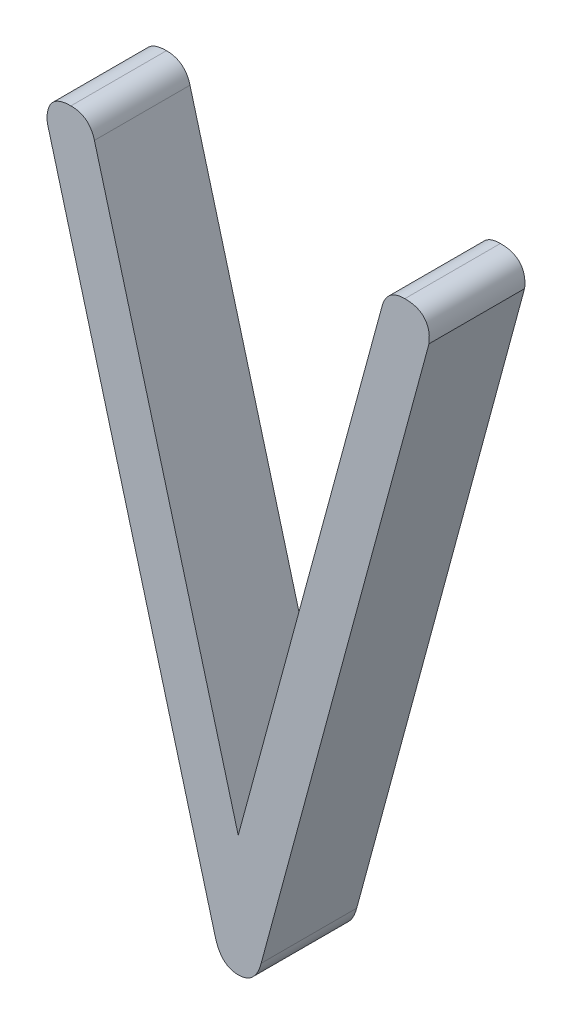
ISO-10303-21;
HEADER;
FILE_DESCRIPTION(('STEP AP214'),'2;1');
FILE_NAME('part.step','',(''),(''),'','','');
FILE_SCHEMA(('AUTOMOTIVE_DESIGN { 1 0 10303 214 1 1 1 1 }'));
ENDSEC;
DATA;
#1=APPLICATION_CONTEXT('core data for automotive mechanical design processes');
#2=APPLICATION_PROTOCOL_DEFINITION('international standard','automotive_design',2000,#1);
#3=PRODUCT_CONTEXT('',#1,'mechanical');
#4=PRODUCT('Part','Part','',(#3));
#5=PRODUCT_RELATED_PRODUCT_CATEGORY('part','',(#4));
#6=PRODUCT_DEFINITION_FORMATION('','',#4);
#7=PRODUCT_DEFINITION_CONTEXT('part definition',#1,'design');
#8=PRODUCT_DEFINITION('design','',#6,#7);
#9=PRODUCT_DEFINITION_SHAPE('','',#8);
#10=(LENGTH_UNIT() NAMED_UNIT(*) SI_UNIT(.MILLI.,.METRE.));
#11=(NAMED_UNIT(*) PLANE_ANGLE_UNIT() SI_UNIT($,.RADIAN.));
#12=(NAMED_UNIT(*) SI_UNIT($,.STERADIAN.) SOLID_ANGLE_UNIT());
#13=UNCERTAINTY_MEASURE_WITH_UNIT(LENGTH_MEASURE(1.E-05),#10,'distance_accuracy_value','');
#14=(GEOMETRIC_REPRESENTATION_CONTEXT(3) GLOBAL_UNCERTAINTY_ASSIGNED_CONTEXT((#13)) GLOBAL_UNIT_ASSIGNED_CONTEXT((#10,
#11,#12)) REPRESENTATION_CONTEXT('',''));
#15=CARTESIAN_POINT('',(0.,0.,0.));
#16=DIRECTION('',(0.,0.,1.));
#17=DIRECTION('',(1.,0.,0.));
#18=AXIS2_PLACEMENT_3D('',#15,#16,#17);
#19=CARTESIAN_POINT('',(0.,0.,-0.1));
#20=DIRECTION('',(0.,0.,1.));
#21=DIRECTION('',(1.,0.,0.));
#22=AXIS2_PLACEMENT_3D('',#19,#20,#21);
#23=PLANE('',#22);
#24=DIRECTION('',(0.261841637735637,-0.96511085205168,0.));
#25=VECTOR('',#24,1.);
#26=CARTESIAN_POINT('',(20.5513802553988,5.1464524175906,-0.1));
#27=LINE('',#26,#25);
#28=CARTESIAN_POINT('',(20.5508815053987,5.1502761675906,-0.1));
#29=VERTEX_POINT('',#28);
#30=CARTESIAN_POINT('',(20.7264677553988,4.5011049175906,-0.1));
#31=VERTEX_POINT('',#30);
#32=EDGE_CURVE('E125',#29,#31,#27,.T.);
#33=ORIENTED_EDGE('',*,*,#32,.F.);
#34=CARTESIAN_POINT('',(20.5503827553987,5.1502761675906,-0.1));
#35=CARTESIAN_POINT('',(20.5503926914682,5.15131923329889,-0.1));
#36=CARTESIAN_POINT('',(20.5503822868826,5.15236313262038,-0.1));
#37=CARTESIAN_POINT('',(20.5503832259426,5.15445522281212,-0.1));
#38=CARTESIAN_POINT('',(20.5503946639154,5.15550341270101,-0.1));
#39=CARTESIAN_POINT('',(20.5505591669211,5.1586917506111,-0.1));
#40=CARTESIAN_POINT('',(20.550847726788,5.1608284842916,-0.1));
#41=CARTESIAN_POINT('',(20.5519335163355,5.16506486304129,-0.1));
#42=CARTESIAN_POINT('',(20.5527472786877,5.16716093512788,-0.1));
#43=CARTESIAN_POINT('',(20.5550934541722,5.1709583618669,-0.1));
#44=CARTESIAN_POINT('',(20.5566312812085,5.17265659610451,-0.1));
#45=CARTESIAN_POINT('',(20.5600219457876,5.17520395245335,-0.1));
#46=CARTESIAN_POINT('',(20.5618239221849,5.1761241445683,-0.1));
#47=CARTESIAN_POINT('',(20.5668126279588,5.17794027385817,-0.1));
#48=CARTESIAN_POINT('',(20.5701348321766,5.17842750106713,-0.1));
#49=CARTESIAN_POINT('',(20.5740958257601,5.17858686534779,-0.1));
#50=CARTESIAN_POINT('',(20.5747530930678,5.17859927637395,-0.1));
#51=CARTESIAN_POINT('',(20.5754077553988,5.1785999175906,-0.1));
#52=B_SPLINE_CURVE_WITH_KNOTS('',3,(#34,#35,#36,#37,#38,#39,#40,#41,#42,#43,#44,#45,#46,#47,#48,
#49,#50,#51),.UNSPECIFIED.,.F.,.F.,(4,2,2,2,2,2,2,2,4),(0.,0.00313075123016277,
0.00627505320438631,0.0127047529926475,0.0193474314733686,0.0260405864184235,0.032022274007408,
0.0419124095932146,0.0438827667619286),.UNSPECIFIED.);
#53=CARTESIAN_POINT('',(20.5754077553988,5.1785999175906,-0.1));
#54=VERTEX_POINT('',#53);
#55=EDGE_CURVE('E273',#29,#54,#52,.T.);
#56=ORIENTED_EDGE('',*,*,#55,.T.);
#57=CARTESIAN_POINT('',(20.5754077553988,5.1785999175906,-0.1));
#58=CARTESIAN_POINT('',(20.5771220932541,5.1785979741548,-0.1));
#59=CARTESIAN_POINT('',(20.5788500136896,5.17848730559865,-0.1));
#60=CARTESIAN_POINT('',(20.5822779690591,5.17796685450748,-0.1));
#61=CARTESIAN_POINT('',(20.5839774528449,5.17755363826389,-0.1));
#62=CARTESIAN_POINT('',(20.5878340448713,5.17612688013809,-0.1));
#63=CARTESIAN_POINT('',(20.5899382341426,5.17495181002841,-0.1));
#64=CARTESIAN_POINT('',(20.593598454675,5.17194147811202,-0.1));
#65=CARTESIAN_POINT('',(20.5951543307068,5.17010602964674,-0.1));
#66=CARTESIAN_POINT('',(20.5972446719747,5.1667848040212,-0.1));
#67=CARTESIAN_POINT('',(20.5979464602816,5.16539449490216,-0.1));
#68=CARTESIAN_POINT('',(20.5991334522155,5.16254471216893,-0.1));
#69=CARTESIAN_POINT('',(20.599621447486,5.16108642331219,-0.1));
#70=CARTESIAN_POINT('',(20.6000302553988,5.1596124175906,-0.1));
#71=B_SPLINE_CURVE_WITH_KNOTS('',3,(#57,#58,#59,#60,#61,#62,#63,#64,#65,#66,#67,#68,#69,#70),
.UNSPECIFIED.,.F.,.F.,(4,2,2,2,2,2,4),(0.,0.00515979265660272,0.0103790714029258,
0.0174595134135614,0.0245419583133709,0.0291992832963221,0.0337938368651175),.UNSPECIFIED.);
#72=CARTESIAN_POINT('',(20.6000302553988,5.1596124175906,-0.1));
#73=VERTEX_POINT('',#72);
#74=EDGE_CURVE('E132',#54,#73,#71,.T.);
#75=ORIENTED_EDGE('',*,*,#74,.T.);
#76=DIRECTION('',(-0.261857023404159,0.965106677675537,0.));
#77=VECTOR('',#76,1.);
#78=CARTESIAN_POINT('',(20.7504952553988,4.6050549175906,-0.1));
#79=LINE('',#78,#77);
#80=CARTESIAN_POINT('',(20.7504952553988,4.60505491759061,-0.1));
#81=VERTEX_POINT('',#80);
#82=EDGE_CURVE('E129',#81,#73,#79,.T.);
#83=ORIENTED_EDGE('',*,*,#82,.F.);
#84=DIRECTION('',(-0.261820959999833,-0.965116461834926,0.));
#85=VECTOR('',#84,1.);
#86=CARTESIAN_POINT('',(20.9009427553987,5.1596299175906,-0.1));
#87=LINE('',#86,#85);
#88=CARTESIAN_POINT('',(20.9009427553987,5.1596299175906,-0.1));
#89=VERTEX_POINT('',#88);
#90=EDGE_CURVE('E136',#89,#81,#87,.T.);
#91=ORIENTED_EDGE('',*,*,#90,.F.);
#92=CARTESIAN_POINT('',(20.9009427553987,5.1596299175906,-0.1));
#93=CARTESIAN_POINT('',(20.9013777429837,5.16123757433473,-0.1));
#94=CARTESIAN_POINT('',(20.9019049288769,5.16283119943136,-0.1));
#95=CARTESIAN_POINT('',(20.9032121772409,5.16593741324232,-0.1));
#96=CARTESIAN_POINT('',(20.9039959831498,5.16744839023491,-0.1));
#97=CARTESIAN_POINT('',(20.906231879075,5.17082008145454,-0.1));
#98=CARTESIAN_POINT('',(20.9078246946511,5.17259595674711,-0.1));
#99=CARTESIAN_POINT('',(20.9115483796059,5.17546501299798,-0.1));
#100=CARTESIAN_POINT('',(20.9136805900192,5.17655646848187,-0.1));
#101=CARTESIAN_POINT('',(20.9173603988267,5.17776821155771,-0.1));
#102=CARTESIAN_POINT('',(20.918849400089,5.17809515677756,-0.1));
#103=CARTESIAN_POINT('',(20.9218442270327,5.17850849568542,-0.1));
#104=CARTESIAN_POINT('',(20.9233496473208,5.17859768028002,-0.1));
#105=CARTESIAN_POINT('',(20.9248477553988,5.1785999175906,-0.1));
#106=B_SPLINE_CURVE_WITH_KNOTS('',3,(#92,#93,#94,#95,#96,#97,#98,#99,#100,#101,#102,#103,#104,
#105),.UNSPECIFIED.,.F.,.F.,(4,2,2,2,2,2,4),(0.,0.00500870235049051,0.0100939920533278,
0.0171088488728929,0.0241413203207593,0.028696895640469,0.0331987558213404),.UNSPECIFIED.);
#107=CARTESIAN_POINT('',(20.9248477553988,5.1785999175906,-0.1));
#108=VERTEX_POINT('',#107);
#109=EDGE_CURVE('E242',#89,#108,#106,.T.);
#110=ORIENTED_EDGE('',*,*,#109,.T.);
#111=CARTESIAN_POINT('',(20.9248477553988,5.1785999175906,-0.1));
#112=CARTESIAN_POINT('',(20.9285446784325,5.17860849001704,-0.1));
#113=CARTESIAN_POINT('',(20.932547482492,5.17821770700011,-0.1));
#114=CARTESIAN_POINT('',(20.9383785751184,5.17634146861894,-0.1));
#115=CARTESIAN_POINT('',(20.9404147789504,5.17538385358481,-0.1));
#116=CARTESIAN_POINT('',(20.9440457906898,5.17276736871181,-0.1));
#117=CARTESIAN_POINT('',(20.9456374338623,5.17110367334118,-0.1));
#118=CARTESIAN_POINT('',(20.9479678477753,5.16752341263488,-0.1));
#119=CARTESIAN_POINT('',(20.9487766177684,5.16564946446871,-0.1));
#120=CARTESIAN_POINT('',(20.9498553104023,5.16204020458042,-0.1));
#121=CARTESIAN_POINT('',(20.9501832660136,5.16032036223004,-0.1));
#122=CARTESIAN_POINT('',(20.9505561402529,5.15684711309351,-0.1));
#123=CARTESIAN_POINT('',(20.9505995325504,5.15509357582134,-0.1));
#124=CARTESIAN_POINT('',(20.9506125523949,5.15231810631168,-0.1));
#125=CARTESIAN_POINT('',(20.9506053803397,5.15129574251738,-0.1));
#126=CARTESIAN_POINT('',(20.9506077553988,5.15027616759061,-0.1));
#127=B_SPLINE_CURVE_WITH_KNOTS('',3,(#111,#112,#113,#114,#115,#116,#117,#118,#119,#120,#121,
#122,#123,#124,#125,#126),.UNSPECIFIED.,.F.,.F.,(4,2,2,2,2,2,2,4),(0.,0.0114964904955316,
0.0181713735883877,0.0248926283547071,0.0309338278853881,0.0361589297978823,0.0414120351607045,
0.0444765603155986),.UNSPECIFIED.);
#128=CARTESIAN_POINT('',(20.9501002553988,5.15027616759061,-0.1));
#129=VERTEX_POINT('',#128);
#130=EDGE_CURVE('E142',#108,#129,#127,.T.);
#131=ORIENTED_EDGE('',*,*,#130,.T.);
#132=DIRECTION('',(0.261841637735637,0.96511085205168,0.));
#133=VECTOR('',#132,1.);
#134=CARTESIAN_POINT('',(20.7745052553987,4.5011049175906,-0.1));
#135=LINE('',#134,#133);
#136=CARTESIAN_POINT('',(20.7745052553987,4.5011049175906,-0.1));
#137=VERTEX_POINT('',#136);
#138=EDGE_CURVE('E105',#137,#129,#135,.T.);
#139=ORIENTED_EDGE('',*,*,#138,.F.);
#140=CARTESIAN_POINT('',(20.7745052553987,4.5011049175906,-0.1));
#141=CARTESIAN_POINT('',(20.7734513501889,4.497031947576,-0.1));
#142=CARTESIAN_POINT('',(20.7718391726223,4.49274022927304,-0.1));
#143=CARTESIAN_POINT('',(20.7680751256805,4.48690019066076,-0.1));
#144=CARTESIAN_POINT('',(20.7664474830121,4.48496286314128,-0.1));
#145=CARTESIAN_POINT('',(20.763549435342,4.4825598583929,-0.1));
#146=CARTESIAN_POINT('',(20.7625012533111,4.48184049428395,-0.1));
#147=CARTESIAN_POINT('',(20.7602822340124,4.48061403594939,-0.1));
#148=CARTESIAN_POINT('',(20.7591108780044,4.48010788838571,-0.1));
#149=CARTESIAN_POINT('',(20.7567066422162,4.47932353026134,-0.1));
#150=CARTESIAN_POINT('',(20.7554743331198,4.4790435189457,-0.1));
#151=CARTESIAN_POINT('',(20.7529853618357,4.47868100202924,-0.1));
#152=CARTESIAN_POINT('',(20.7517288194802,4.47859769550437,-0.1));
#153=CARTESIAN_POINT('',(20.7504777553988,4.4785999175906,-0.1));
#154=B_SPLINE_CURVE_WITH_KNOTS('',3,(#140,#141,#142,#143,#144,#145,#146,#147,#148,#149,#150,
#151,#152,#153),.UNSPECIFIED.,.F.,.F.,(4,2,2,2,2,2,4),(0.,0.0130938825250307,0.0205978279718477,
0.024385869987406,0.0281905576840755,0.0319646408114679,0.0357233302826738),.UNSPECIFIED.);
#155=CARTESIAN_POINT('',(20.7504777553988,4.4785999175906,-0.1));
#156=VERTEX_POINT('',#155);
#157=EDGE_CURVE('E100',#137,#156,#154,.T.);
#158=ORIENTED_EDGE('',*,*,#157,.T.);
#159=CARTESIAN_POINT('',(20.7504777553988,4.4785999175906,-0.1));
#160=CARTESIAN_POINT('',(20.7492059868726,4.47860100638479,-0.1));
#161=CARTESIAN_POINT('',(20.7479299963499,4.47868547864956,-0.1));
#162=CARTESIAN_POINT('',(20.745405068384,4.47905714635881,-0.1));
#163=CARTESIAN_POINT('',(20.7441562242563,4.47934495312802,-0.1));
#164=CARTESIAN_POINT('',(20.7405102196661,4.48056888496283,-0.1));
#165=CARTESIAN_POINT('',(20.7382197635953,4.48186584697579,-0.1));
#166=CARTESIAN_POINT('',(20.7345314163769,4.48498347947588,-0.1));
#167=CARTESIAN_POINT('',(20.7330591785432,4.48672208645621,-0.1));
#168=CARTESIAN_POINT('',(20.7295492226181,4.49197653053387,-0.0999999999999999));
#169=CARTESIAN_POINT('',(20.7280005509623,4.49580189288801,-0.0999999999999999));
#170=CARTESIAN_POINT('',(20.7267248181419,4.50016427259193,-0.1));
#171=CARTESIAN_POINT('',(20.7265935687219,4.50063443497494,-0.1));
#172=CARTESIAN_POINT('',(20.7264677553988,4.5011049175906,-0.1));
#173=B_SPLINE_CURVE_WITH_KNOTS('',3,(#159,#160,#161,#162,#163,#164,#165,#166,#167,#168,#169,
#170,#171,#172),.UNSPECIFIED.,.F.,.F.,(4,2,2,2,2,2,4),(0.,0.00381795813841378,
0.00764744407759295,0.0153238713628667,0.0220741473082082,0.0342216202552871,0.03568553496631),.UNSPECIFIED.);
#174=EDGE_CURVE('E24',#156,#31,#173,.T.);
#175=ORIENTED_EDGE('',*,*,#174,.T.);
#176=EDGE_LOOP('',(#33,#56,#75,#83,#91,#110,#131,#139,#158,#175));
#177=FACE_BOUND('',#176,.T.);
#178=ADVANCED_FACE('F17',(#177),#23,.F.);
#179=CARTESIAN_POINT('',(20.7264677553988,4.5011049175906,-0.1));
#180=CARTESIAN_POINT('',(20.7324702553988,4.4785999175906,-0.1));
#181=CARTESIAN_POINT('',(20.7504777553988,4.4785999175906,-0.1));
#182=CARTESIAN_POINT('',(20.7264677553988,4.5011049175906,0.));
#183=CARTESIAN_POINT('',(20.7324702553988,4.4785999175906,0.));
#184=CARTESIAN_POINT('',(20.7504777553988,4.4785999175906,0.));
#185=B_SPLINE_SURFACE_WITH_KNOTS('',1,2,((#179,#180,#181),(#182,#183,#184)),.UNSPECIFIED.,.F.,
.F.,.F.,(2,2),(3,3),(0.,1.),(0.,1.),.UNSPECIFIED.);
#186=DIRECTION('',(0.,0.,1.));
#187=VECTOR('',#186,1.);
#188=CARTESIAN_POINT('',(20.7264677553988,4.5011049175906,-0.1));
#189=LINE('',#188,#187);
#190=CARTESIAN_POINT('',(20.7264677553988,4.5011049175906,0.));
#191=VERTEX_POINT('',#190);
#192=EDGE_CURVE('E114',#31,#191,#189,.T.);
#193=DIRECTION('',(0.,0.,1.));
#194=VECTOR('',#193,1.);
#195=CARTESIAN_POINT('',(20.7504777553988,4.4785999175906,-0.05));
#196=LINE('',#195,#194);
#197=CARTESIAN_POINT('',(20.7504777553988,4.4785999175906,0.));
#198=VERTEX_POINT('',#197);
#199=EDGE_CURVE('E109',#156,#198,#196,.T.);
#200=CARTESIAN_POINT('',(20.7264677553988,4.5011049175906,0.));
#201=CARTESIAN_POINT('',(20.7275221276277,4.49703236671276,0.));
#202=CARTESIAN_POINT('',(20.729133381543,4.49274032524462,0.));
#203=CARTESIAN_POINT('',(20.7328952989371,4.48690019714537,0.));
#204=CARTESIAN_POINT('',(20.7345215813636,4.48496313772351,0.));
#205=CARTESIAN_POINT('',(20.7374175659814,4.48255999201173,0.));
#206=CARTESIAN_POINT('',(20.7384650785732,4.48184047937136,0.));
#207=CARTESIAN_POINT('',(20.7406828468784,4.48061374137611,0.));
#208=CARTESIAN_POINT('',(20.7418536197067,4.48010745886521,0.));
#209=CARTESIAN_POINT('',(20.7442558793498,4.4793232581734,0.));
#210=CARTESIAN_POINT('',(20.7454867419015,4.47904337144059,0.));
#211=CARTESIAN_POINT('',(20.7479728890433,4.47868098166434,0.));
#212=CARTESIAN_POINT('',(20.7492280551648,4.47859768738367,0.));
#213=CARTESIAN_POINT('',(20.7504777553988,4.4785999175906,0.));
#214=B_SPLINE_CURVE_WITH_KNOTS('',3,(#200,#201,#202,#203,#204,#205,#206,#207,#208,#209,#210,
#211,#212,#213),.UNSPECIFIED.,.F.,.F.,(4,2,2,2,2,2,4),(0.,0.0130937867306439,0.02059464785892,
0.0243812846568324,0.0281844934508406,0.0319542660278823,0.0357088401120995),.UNSPECIFIED.);
#215=EDGE_CURVE('E263',#191,#198,#214,.T.);
#216=ORIENTED_EDGE('',*,*,#192,.F.);
#217=ORIENTED_EDGE('',*,*,#174,.F.);
#218=ORIENTED_EDGE('',*,*,#199,.T.);
#219=ORIENTED_EDGE('',*,*,#215,.F.);
#220=EDGE_LOOP('',(#216,#217,#218,#219));
#221=FACE_BOUND('',#220,.T.);
#222=ADVANCED_FACE('F111',(#221),#185,.F.);
#223=CARTESIAN_POINT('',(20.7504777553988,4.4785999175906,-0.1));
#224=CARTESIAN_POINT('',(20.7685027553988,4.4785999175906,-0.1));
#225=CARTESIAN_POINT('',(20.7745052553987,4.5011049175906,-0.1));
#226=CARTESIAN_POINT('',(20.7504777553988,4.4785999175906,0.));
#227=CARTESIAN_POINT('',(20.7685027553988,4.4785999175906,0.));
#228=CARTESIAN_POINT('',(20.7745052553987,4.5011049175906,0.));
#229=B_SPLINE_SURFACE_WITH_KNOTS('',1,2,((#223,#224,#225),(#226,#227,#228)),.UNSPECIFIED.,.F.,
.F.,.F.,(2,2),(3,3),(0.,1.),(0.,1.),.UNSPECIFIED.);
#230=DIRECTION('',(0.,0.,1.));
#231=VECTOR('',#230,1.);
#232=CARTESIAN_POINT('',(20.7745052553987,4.5011049175906,-0.1));
#233=LINE('',#232,#231);
#234=CARTESIAN_POINT('',(20.7745052553987,4.5011049175906,0.));
#235=VERTEX_POINT('',#234);
#236=EDGE_CURVE('E120',#235,#137,#233,.F.);
#237=CARTESIAN_POINT('',(20.7504777553988,4.4785999175906,0.));
#238=CARTESIAN_POINT('',(20.7517514337389,4.47860102381493,0.));
#239=CARTESIAN_POINT('',(20.7530293469448,4.47868557449693,0.));
#240=CARTESIAN_POINT('',(20.7555581355951,4.47905768099655,0.));
#241=CARTESIAN_POINT('',(20.7568089165475,4.47934585600213,0.));
#242=CARTESIAN_POINT('',(20.760460606622,4.48057157418933,0.));
#243=CARTESIAN_POINT('',(20.7627546567312,4.48187063842538,0.));
#244=CARTESIAN_POINT('',(20.7664471332069,4.48499294041424,0.));
#245=CARTESIAN_POINT('',(20.7679203956853,4.48673360329477,0.));
#246=CARTESIAN_POINT('',(20.7714308511796,4.49199227282236,0.));
#247=CARTESIAN_POINT('',(20.772978990632,4.49581963978829,0.));
#248=CARTESIAN_POINT('',(20.7742518331305,4.50017730249887,0.));
#249=CARTESIAN_POINT('',(20.7743811910074,4.50064095174428,0.));
#250=CARTESIAN_POINT('',(20.7745052553987,4.5011049175906,0.));
#251=B_SPLINE_CURVE_WITH_KNOTS('',3,(#237,#238,#239,#240,#241,#242,#243,#244,#245,#246,#247,
#248,#249,#250),.UNSPECIFIED.,.F.,.F.,(4,2,2,2,2,2,4),(0.,0.00382370389000962,
0.00765908535028387,0.0153473873778807,0.0221042106873985,0.034256344667909,0.0356999344152006),.UNSPECIFIED.);
#252=EDGE_CURVE('E118',#198,#235,#251,.T.);
#253=ORIENTED_EDGE('',*,*,#199,.F.);
#254=ORIENTED_EDGE('',*,*,#157,.F.);
#255=ORIENTED_EDGE('',*,*,#236,.F.);
#256=ORIENTED_EDGE('',*,*,#252,.F.);
#257=EDGE_LOOP('',(#253,#254,#255,#256));
#258=FACE_BOUND('',#257,.T.);
#259=ADVANCED_FACE('F116',(#258),#229,.F.);
#260=CARTESIAN_POINT('',(20.7745052553987,4.5011049175906,-0.1));
#261=DIRECTION('',(0.96511085205168,-0.261841637735637,0.));
#262=DIRECTION('',(0.261841637735637,0.96511085205168,0.));
#263=AXIS2_PLACEMENT_3D('',#260,#261,#262);
#264=PLANE('',#263);
#265=ORIENTED_EDGE('',*,*,#138,.T.);
#266=DIRECTION('',(0.,0.,1.));
#267=VECTOR('',#266,1.);
#268=CARTESIAN_POINT('',(20.9506077553988,5.1501935625185,-0.1));
#269=LINE('',#268,#267);
#270=CARTESIAN_POINT('',(20.9501002553988,5.15027616759061,0.));
#271=VERTEX_POINT('',#270);
#272=EDGE_CURVE('E248',#129,#271,#269,.T.);
#273=ORIENTED_EDGE('',*,*,#272,.T.);
#274=DIRECTION('',(0.261841637735772,0.965110852051643,0.));
#275=VECTOR('',#274,1.);
#276=CARTESIAN_POINT('',(20.7745052553987,4.5011049175906,0.));
#277=LINE('',#276,#275);
#278=EDGE_CURVE('E261',#235,#271,#277,.T.);
#279=ORIENTED_EDGE('',*,*,#278,.F.);
#280=ORIENTED_EDGE('',*,*,#236,.T.);
#281=EDGE_LOOP('',(#265,#273,#279,#280));
#282=FACE_BOUND('',#281,.T.);
#283=ADVANCED_FACE('F195',(#282),#264,.T.);
#284=CARTESIAN_POINT('',(20.9506077553988,5.14995922509061,-0.1));
#285=CARTESIAN_POINT('',(20.9506077553988,5.1520295713406,-0.1));
#286=CARTESIAN_POINT('',(20.9506077553988,5.1540999175906,-0.1));
#287=CARTESIAN_POINT('',(20.9506077553988,5.1785999175906,-0.1));
#288=CARTESIAN_POINT('',(20.9248477553988,5.1785999175906,-0.1));
#289=CARTESIAN_POINT('',(20.9506077553988,5.14995922509061,0.));
#290=CARTESIAN_POINT('',(20.9506077553988,5.1520295713406,0.));
#291=CARTESIAN_POINT('',(20.9506077553988,5.1540999175906,0.));
#292=CARTESIAN_POINT('',(20.9506077553988,5.1785999175906,0.));
#293=CARTESIAN_POINT('',(20.9248477553988,5.1785999175906,0.));
#294=B_SPLINE_SURFACE_WITH_KNOTS('',1,2,((#284,#285,#286,#287,#288),(#289,#290,#291,#292,#293)),
.UNSPECIFIED.,.F.,.F.,.F.,(2,2),(3,2,3),(0.,1.),(-0.0845039285713122,0.,1.),.UNSPECIFIED.);
#295=DIRECTION('',(0.,0.,1.));
#296=VECTOR('',#295,1.);
#297=CARTESIAN_POINT('',(20.9248477553988,5.1785999175906,-0.05));
#298=LINE('',#297,#296);
#299=CARTESIAN_POINT('',(20.9248477553988,5.1785999175906,0.));
#300=VERTEX_POINT('',#299);
#301=EDGE_CURVE('E247',#108,#300,#298,.T.);
#302=CARTESIAN_POINT('',(20.9506077553988,5.15027616759061,0.));
#303=CARTESIAN_POINT('',(20.9505966781294,5.15128182177798,0.));
#304=CARTESIAN_POINT('',(20.9506068071444,5.15228827879153,0.));
#305=CARTESIAN_POINT('',(20.950608707316,5.1543049130354,0.));
#306=CARTESIAN_POINT('',(20.9506004074118,5.15531508961929,0.));
#307=CARTESIAN_POINT('',(20.9504534524747,5.15838610597548,0.));
#308=CARTESIAN_POINT('',(20.9501878623184,5.16044383266257,0.));
#309=CARTESIAN_POINT('',(20.9491581682876,5.16464643509731,0.));
#310=CARTESIAN_POINT('',(20.9483516789197,5.16678269253233,0.));
#311=CARTESIAN_POINT('',(20.9460013725212,5.17065691371378,0.));
#312=CARTESIAN_POINT('',(20.9444520213474,5.17239174067836,0.));
#313=CARTESIAN_POINT('',(20.9410331107959,5.17499873961112,0.));
#314=CARTESIAN_POINT('',(20.9392167603611,5.17594425462327,0.));
#315=CARTESIAN_POINT('',(20.9341525060613,5.17784061009026,0.));
#316=CARTESIAN_POINT('',(20.9307613094171,5.17836996258643,0.));
#317=CARTESIAN_POINT('',(20.9265357034986,5.17857949200225,0.));
#318=CARTESIAN_POINT('',(20.9256894742491,5.17859875078118,0.));
#319=CARTESIAN_POINT('',(20.9248477553988,5.1785999175906,0.));
#320=B_SPLINE_CURVE_WITH_KNOTS('',3,(#302,#303,#304,#305,#306,#307,#308,#309,#310,#311,#312,
#313,#314,#315,#316,#317,#318,#319),.UNSPECIFIED.,.F.,.F.,(4,2,2,2,2,2,2,2,4),(0.,
0.00301848469965501,0.00604862868268553,0.0122393137992364,0.0189826372191297,
0.0257769963324135,0.0318318197587757,0.0419463219560091,0.0444820605668086),.UNSPECIFIED.);
#321=EDGE_CURVE('E188',#271,#300,#320,.T.);
#322=ORIENTED_EDGE('',*,*,#272,.F.);
#323=ORIENTED_EDGE('',*,*,#130,.F.);
#324=ORIENTED_EDGE('',*,*,#301,.T.);
#325=ORIENTED_EDGE('',*,*,#321,.F.);
#326=EDGE_LOOP('',(#322,#323,#324,#325));
#327=FACE_BOUND('',#326,.T.);
#328=ADVANCED_FACE('F189',(#327),#294,.F.);
#329=CARTESIAN_POINT('',(20.9248477553988,5.1785999175906,-0.1));
#330=CARTESIAN_POINT('',(20.9060352553988,5.1785999175906,-0.1));
#331=CARTESIAN_POINT('',(20.9009427553987,5.1596299175906,-0.1));
#332=CARTESIAN_POINT('',(20.9248477553988,5.1785999175906,0.));
#333=CARTESIAN_POINT('',(20.9060352553988,5.1785999175906,0.));
#334=CARTESIAN_POINT('',(20.9009427553987,5.1596299175906,0.));
#335=B_SPLINE_SURFACE_WITH_KNOTS('',1,2,((#329,#330,#331),(#332,#333,#334)),.UNSPECIFIED.,.F.,
.F.,.F.,(2,2),(3,3),(0.,1.),(0.,1.),.UNSPECIFIED.);
#336=DIRECTION('',(0.,0.,1.));
#337=VECTOR('',#336,1.);
#338=CARTESIAN_POINT('',(20.9009427553987,5.1596299175906,-0.1));
#339=LINE('',#338,#337);
#340=CARTESIAN_POINT('',(20.9009427553987,5.1596299175906,0.));
#341=VERTEX_POINT('',#340);
#342=EDGE_CURVE('E138',#341,#89,#339,.F.);
#343=CARTESIAN_POINT('',(20.9248477553988,5.1785999175906,0.));
#344=CARTESIAN_POINT('',(20.923172182801,5.1785983129812,0.));
#345=CARTESIAN_POINT('',(20.9214830993021,5.17848570718742,0.));
#346=CARTESIAN_POINT('',(20.9181382736322,5.1779583626626,0.));
#347=CARTESIAN_POINT('',(20.9164830299369,5.17754063106995,0.));
#348=CARTESIAN_POINT('',(20.9127508180769,5.17610797139003,0.));
#349=CARTESIAN_POINT('',(20.9107268356681,5.17493610719351,0.));
#350=CARTESIAN_POINT('',(20.9072273040957,5.17197841403111,0.));
#351=CARTESIAN_POINT('',(20.9057514878367,5.17019288489378,0.));
#352=CARTESIAN_POINT('',(20.9028750402661,5.16557260746173,0.));
#353=CARTESIAN_POINT('',(20.9016924321006,5.16259148071783,0.));
#354=CARTESIAN_POINT('',(20.9009427553987,5.1596299175906,0.));
#355=B_SPLINE_CURVE_WITH_KNOTS('',3,(#343,#344,#345,#346,#347,#348,#349,#350,#351,#352,#353,
#354),.UNSPECIFIED.,.F.,.F.,(4,2,2,2,2,4),(0.,0.00504287618517923,0.010135891777729,
0.0169963092322651,0.0238533795316728,0.0331771308777285),.UNSPECIFIED.);
#356=EDGE_CURVE('E177',#300,#341,#355,.T.);
#357=ORIENTED_EDGE('',*,*,#301,.F.);
#358=ORIENTED_EDGE('',*,*,#109,.F.);
#359=ORIENTED_EDGE('',*,*,#342,.F.);
#360=ORIENTED_EDGE('',*,*,#356,.F.);
#361=EDGE_LOOP('',(#357,#358,#359,#360));
#362=FACE_BOUND('',#361,.T.);
#363=ADVANCED_FACE('F194',(#362),#335,.F.);
#364=CARTESIAN_POINT('',(20.9009427553987,5.1596299175906,-0.1));
#365=DIRECTION('',(-0.965116461834926,0.261820959999833,0.));
#366=DIRECTION('',(-0.261820959999833,-0.965116461834926,0.));
#367=AXIS2_PLACEMENT_3D('',#364,#365,#366);
#368=PLANE('',#367);
#369=ORIENTED_EDGE('',*,*,#90,.T.);
#370=DIRECTION('',(0.,0.,1.));
#371=VECTOR('',#370,1.);
#372=CARTESIAN_POINT('',(20.7504952553988,4.6050549175906,-0.1));
#373=LINE('',#372,#371);
#374=CARTESIAN_POINT('',(20.7504952553988,4.6050549175906,0.));
#375=VERTEX_POINT('',#374);
#376=EDGE_CURVE('E133',#375,#81,#373,.F.);
#377=ORIENTED_EDGE('',*,*,#376,.F.);
#378=DIRECTION('',(-0.261820959999676,-0.965116461834968,0.));
#379=VECTOR('',#378,1.);
#380=CARTESIAN_POINT('',(20.9009427553987,5.1596299175906,0.));
#381=LINE('',#380,#379);
#382=EDGE_CURVE('E286',#341,#375,#381,.T.);
#383=ORIENTED_EDGE('',*,*,#382,.F.);
#384=ORIENTED_EDGE('',*,*,#342,.T.);
#385=EDGE_LOOP('',(#369,#377,#383,#384));
#386=FACE_BOUND('',#385,.T.);
#387=ADVANCED_FACE('F283',(#386),#368,.T.);
#388=CARTESIAN_POINT('',(20.7504952553988,4.6050549175906,-0.1));
#389=DIRECTION('',(0.965106677675537,0.261857023404159,0.));
#390=DIRECTION('',(-0.261857023404159,0.965106677675537,0.));
#391=AXIS2_PLACEMENT_3D('',#388,#389,#390);
#392=PLANE('',#391);
#393=ORIENTED_EDGE('',*,*,#82,.T.);
#394=DIRECTION('',(0.,0.,1.));
#395=VECTOR('',#394,1.);
#396=CARTESIAN_POINT('',(20.6000302553988,5.1596124175906,-0.05));
#397=LINE('',#396,#395);
#398=CARTESIAN_POINT('',(20.6000302553988,5.1596124175906,0.));
#399=VERTEX_POINT('',#398);
#400=EDGE_CURVE('E274',#73,#399,#397,.T.);
#401=ORIENTED_EDGE('',*,*,#400,.T.);
#402=DIRECTION('',(-0.261857023404153,0.965106677675539,0.));
#403=VECTOR('',#402,1.);
#404=CARTESIAN_POINT('',(20.7504952553988,4.6050549175906,0.));
#405=LINE('',#404,#403);
#406=EDGE_CURVE('E294',#375,#399,#405,.T.);
#407=ORIENTED_EDGE('',*,*,#406,.F.);
#408=ORIENTED_EDGE('',*,*,#376,.T.);
#409=EDGE_LOOP('',(#393,#401,#407,#408));
#410=FACE_BOUND('',#409,.T.);
#411=ADVANCED_FACE('F292',(#410),#392,.T.);
#412=CARTESIAN_POINT('',(20.6000302553988,5.1596124175906,-0.1));
#413=CARTESIAN_POINT('',(20.5947977553988,5.1785999175906,-0.1));
#414=CARTESIAN_POINT('',(20.5754077553988,5.1785999175906,-0.1));
#415=CARTESIAN_POINT('',(20.6000302553988,5.1596124175906,0.));
#416=CARTESIAN_POINT('',(20.5947977553988,5.1785999175906,0.));
#417=CARTESIAN_POINT('',(20.5754077553988,5.1785999175906,0.));
#418=B_SPLINE_SURFACE_WITH_KNOTS('',1,2,((#412,#413,#414),(#415,#416,#417)),.UNSPECIFIED.,.F.,
.F.,.F.,(2,2),(3,3),(0.,1.),(0.,1.),.UNSPECIFIED.);
#419=DIRECTION('',(0.,0.,1.));
#420=VECTOR('',#419,1.);
#421=CARTESIAN_POINT('',(20.5754077553988,5.1785999175906,-0.05));
#422=LINE('',#421,#420);
#423=CARTESIAN_POINT('',(20.5754077553988,5.1785999175906,0.));
#424=VERTEX_POINT('',#423);
#425=EDGE_CURVE('E271',#54,#424,#422,.T.);
#426=CARTESIAN_POINT('',(20.6000302553988,5.1596124175906,0.));
#427=CARTESIAN_POINT('',(20.5995730852842,5.16126092319438,0.));
#428=CARTESIAN_POINT('',(20.5990147869937,5.16289411321819,0.));
#429=CARTESIAN_POINT('',(20.5976284125924,5.16606530273568,0.));
#430=CARTESIAN_POINT('',(20.5967967918934,5.16760171713585,0.));
#431=CARTESIAN_POINT('',(20.594439057271,5.17099232561119,0.));
#432=CARTESIAN_POINT('',(20.5927699989726,5.17275547139078,0.));
#433=CARTESIAN_POINT('',(20.588912936109,5.17557679284264,0.));
#434=CARTESIAN_POINT('',(20.586724223373,5.17663399891768,0.));
#435=CARTESIAN_POINT('',(20.5829743961818,5.17780209116782,0.));
#436=CARTESIAN_POINT('',(20.5814670433753,5.17811583906038,0.));
#437=CARTESIAN_POINT('',(20.5784400526617,5.17851212237664,0.));
#438=CARTESIAN_POINT('',(20.5769208100093,5.17859752639472,0.));
#439=CARTESIAN_POINT('',(20.5754077553988,5.1785999175906,0.));
#440=B_SPLINE_CURVE_WITH_KNOTS('',3,(#426,#427,#428,#429,#430,#431,#432,#433,#434,#435,#436,
#437,#438,#439),.UNSPECIFIED.,.F.,.F.,(4,2,2,2,2,2,4),(0.,0.00514690530812109,
0.0103633814879602,0.0174990321108579,0.0246444633898091,0.0292476731337199,0.0337927767257381),.UNSPECIFIED.);
#441=EDGE_CURVE('E147',#399,#424,#440,.T.);
#442=ORIENTED_EDGE('',*,*,#400,.F.);
#443=ORIENTED_EDGE('',*,*,#74,.F.);
#444=ORIENTED_EDGE('',*,*,#425,.T.);
#445=ORIENTED_EDGE('',*,*,#441,.F.);
#446=EDGE_LOOP('',(#442,#443,#444,#445));
#447=FACE_BOUND('',#446,.T.);
#448=ADVANCED_FACE('F303',(#447),#418,.F.);
#449=CARTESIAN_POINT('',(20.5754077553988,5.1785999175906,-0.1));
#450=CARTESIAN_POINT('',(20.5503827553987,5.1785999175906,-0.1));
#451=CARTESIAN_POINT('',(20.5503827553987,5.1540999175906,-0.1));
#452=CARTESIAN_POINT('',(20.5503827553987,5.1520295713406,-0.1));
#453=CARTESIAN_POINT('',(20.5503827553987,5.1499592250906,-0.1));
#454=CARTESIAN_POINT('',(20.5754077553988,5.1785999175906,0.));
#455=CARTESIAN_POINT('',(20.5503827553987,5.1785999175906,0.));
#456=CARTESIAN_POINT('',(20.5503827553987,5.1540999175906,0.));
#457=CARTESIAN_POINT('',(20.5503827553987,5.1520295713406,0.));
#458=CARTESIAN_POINT('',(20.5503827553987,5.1499592250906,0.));
#459=B_SPLINE_SURFACE_WITH_KNOTS('',1,2,((#449,#450,#451,#452,#453),(#454,#455,#456,#457,#458)),
.UNSPECIFIED.,.F.,.F.,.F.,(2,2),(3,2,3),(0.,1.),(0.,1.,1.08450392857141),.UNSPECIFIED.);
#460=DIRECTION('',(0.,0.,1.));
#461=VECTOR('',#460,1.);
#462=CARTESIAN_POINT('',(20.5503827553987,5.15012906001975,0.));
#463=LINE('',#462,#461);
#464=CARTESIAN_POINT('',(20.5508815053988,5.1502761675906,0.));
#465=VERTEX_POINT('',#464);
#466=EDGE_CURVE('E44',#465,#29,#463,.F.);
#467=CARTESIAN_POINT('',(20.5754077553988,5.1785999175906,0.));
#468=CARTESIAN_POINT('',(20.5732996979885,5.17859021411981,0.));
#469=CARTESIAN_POINT('',(20.5711556714928,5.17846658649612,0.));
#470=CARTESIAN_POINT('',(20.5668869546992,5.17781389059238,0.));
#471=CARTESIAN_POINT('',(20.5647637796708,5.17727578048195,0.));
#472=CARTESIAN_POINT('',(20.5608131599809,5.17563352126736,0.));
#473=CARTESIAN_POINT('',(20.5589774636218,5.17455202280666,0.));
#474=CARTESIAN_POINT('',(20.5558083684735,5.17179003740366,0.));
#475=CARTESIAN_POINT('',(20.5544769537758,5.17010723404536,0.));
#476=CARTESIAN_POINT('',(20.5522138678295,5.16601840474925,0.));
#477=CARTESIAN_POINT('',(20.5514325829576,5.16353468949719,0.));
#478=CARTESIAN_POINT('',(20.550635790128,5.15922234745333,0.));
#479=CARTESIAN_POINT('',(20.5504637935283,5.15741292608148,0.));
#480=CARTESIAN_POINT('',(20.5503791475224,5.15471297910703,0.));
#481=CARTESIAN_POINT('',(20.5503789374899,5.15382477755235,0.));
#482=CARTESIAN_POINT('',(20.5503865681346,5.15204954183265,0.));
#483=CARTESIAN_POINT('',(20.5503943979041,5.15116250771646,0.));
#484=CARTESIAN_POINT('',(20.5503827553987,5.1502761675906,0.));
#485=B_SPLINE_CURVE_WITH_KNOTS('',3,(#467,#468,#469,#470,#471,#472,#473,#474,#475,#476,#477,
#478,#479,#480,#481,#482,#483,#484),.UNSPECIFIED.,.F.,.F.,(4,2,2,2,2,2,2,2,4),(0.,
0.00637906803399362,0.0129013779903542,0.019171929189677,0.0254669016727172,0.033133973628368,
0.0385746638491169,0.0412386636946684,0.0438990540692793),.UNSPECIFIED.);
#486=EDGE_CURVE('E35',#424,#465,#485,.T.);
#487=ORIENTED_EDGE('',*,*,#425,.F.);
#488=ORIENTED_EDGE('',*,*,#55,.F.);
#489=ORIENTED_EDGE('',*,*,#466,.F.);
#490=ORIENTED_EDGE('',*,*,#486,.F.);
#491=EDGE_LOOP('',(#487,#488,#489,#490));
#492=FACE_BOUND('',#491,.T.);
#493=ADVANCED_FACE('F19',(#492),#459,.F.);
#494=CARTESIAN_POINT('',(20.5513802553988,5.1464524175906,-0.1));
#495=DIRECTION('',(-0.96511085205168,-0.261841637735637,0.));
#496=DIRECTION('',(0.261841637735637,-0.96511085205168,0.));
#497=AXIS2_PLACEMENT_3D('',#494,#495,#496);
#498=PLANE('',#497);
#499=ORIENTED_EDGE('',*,*,#32,.T.);
#500=ORIENTED_EDGE('',*,*,#192,.T.);
#501=DIRECTION('',(0.261841637735637,-0.96511085205168,0.));
#502=VECTOR('',#501,1.);
#503=CARTESIAN_POINT('',(20.5513802553988,5.1464524175906,0.));
#504=LINE('',#503,#502);
#505=EDGE_CURVE('E11',#465,#191,#504,.T.);
#506=ORIENTED_EDGE('',*,*,#505,.F.);
#507=ORIENTED_EDGE('',*,*,#466,.T.);
#508=EDGE_LOOP('',(#499,#500,#506,#507));
#509=FACE_BOUND('',#508,.T.);
#510=ADVANCED_FACE('F162',(#509),#498,.T.);
#511=CARTESIAN_POINT('',(0.,0.,0.));
#512=DIRECTION('',(0.,0.,1.));
#513=DIRECTION('',(1.,0.,0.));
#514=AXIS2_PLACEMENT_3D('',#511,#512,#513);
#515=PLANE('',#514);
#516=ORIENTED_EDGE('',*,*,#486,.T.);
#517=ORIENTED_EDGE('',*,*,#505,.T.);
#518=ORIENTED_EDGE('',*,*,#215,.T.);
#519=ORIENTED_EDGE('',*,*,#252,.T.);
#520=ORIENTED_EDGE('',*,*,#278,.T.);
#521=ORIENTED_EDGE('',*,*,#321,.T.);
#522=ORIENTED_EDGE('',*,*,#356,.T.);
#523=ORIENTED_EDGE('',*,*,#382,.T.);
#524=ORIENTED_EDGE('',*,*,#406,.T.);
#525=ORIENTED_EDGE('',*,*,#441,.T.);
#526=EDGE_LOOP('',(#516,#517,#518,#519,#520,#521,#522,#523,#524,#525));
#527=FACE_BOUND('',#526,.T.);
#528=ADVANCED_FACE('F158',(#527),#515,.T.);
#529=CLOSED_SHELL('',(#178,#222,#259,#283,#328,#363,#387,#411,#448,#493,#510,#528));
#530=MANIFOLD_SOLID_BREP('B1',#529);
#531=ADVANCED_BREP_SHAPE_REPRESENTATION('',(#18,#530),#14);
#532=SHAPE_DEFINITION_REPRESENTATION(#9,#531);
ENDSEC;
END-ISO-10303-21;
